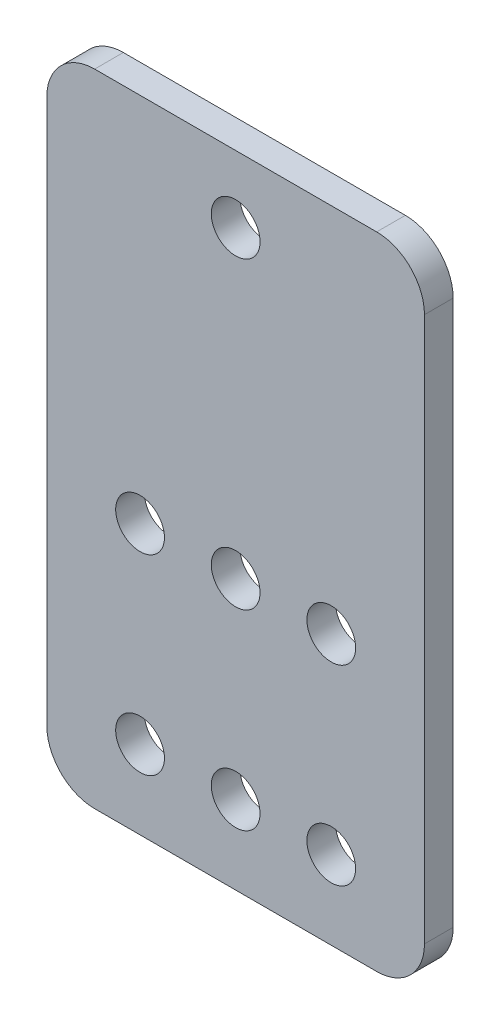
ISO-10303-21;
HEADER;
FILE_DESCRIPTION(('STEP AP214'),'2;1');
FILE_NAME('part.step','',(''),(''),'','','');
FILE_SCHEMA(('AUTOMOTIVE_DESIGN { 1 0 10303 214 1 1 1 1 }'));
ENDSEC;
DATA;
#1=APPLICATION_CONTEXT('core data for automotive mechanical design processes');
#2=APPLICATION_PROTOCOL_DEFINITION('international standard','automotive_design',2000,#1);
#3=PRODUCT_CONTEXT('',#1,'mechanical');
#4=PRODUCT('Part','Part','',(#3));
#5=PRODUCT_RELATED_PRODUCT_CATEGORY('part','',(#4));
#6=PRODUCT_DEFINITION_FORMATION('','',#4);
#7=PRODUCT_DEFINITION_CONTEXT('part definition',#1,'design');
#8=PRODUCT_DEFINITION('design','',#6,#7);
#9=PRODUCT_DEFINITION_SHAPE('','',#8);
#10=(LENGTH_UNIT() NAMED_UNIT(*) SI_UNIT(.MILLI.,.METRE.));
#11=(NAMED_UNIT(*) PLANE_ANGLE_UNIT() SI_UNIT($,.RADIAN.));
#12=(NAMED_UNIT(*) SI_UNIT($,.STERADIAN.) SOLID_ANGLE_UNIT());
#13=UNCERTAINTY_MEASURE_WITH_UNIT(LENGTH_MEASURE(1.E-05),#10,'distance_accuracy_value','');
#14=(GEOMETRIC_REPRESENTATION_CONTEXT(3) GLOBAL_UNCERTAINTY_ASSIGNED_CONTEXT((#13)) GLOBAL_UNIT_ASSIGNED_CONTEXT((#10,
#11,#12)) REPRESENTATION_CONTEXT('',''));
#15=CARTESIAN_POINT('',(0.,0.,0.));
#16=DIRECTION('',(0.,0.,1.));
#17=DIRECTION('',(1.,0.,0.));
#18=AXIS2_PLACEMENT_3D('',#15,#16,#17);
#19=CARTESIAN_POINT('',(14.75,28.5,3.));
#20=DIRECTION('',(0.,0.,-1.));
#21=DIRECTION('',(-1.,0.,0.));
#22=AXIS2_PLACEMENT_3D('',#19,#20,#21);
#23=PLANE('',#22);
#24=CARTESIAN_POINT('',(14.75,28.5,3.));
#25=DIRECTION('',(0.,0.,1.));
#26=DIRECTION('',(-1.,0.,0.));
#27=AXIS2_PLACEMENT_3D('',#24,#25,#26);
#28=CIRCLE('',#27,5.);
#29=CARTESIAN_POINT('',(19.75,28.5,3.));
#30=VERTEX_POINT('',#29);
#31=CARTESIAN_POINT('',(14.75,33.5,3.));
#32=VERTEX_POINT('',#31);
#33=EDGE_CURVE('E151',#30,#32,#28,.T.);
#34=ORIENTED_EDGE('',*,*,#33,.T.);
#35=DIRECTION('',(-1.,0.,0.));
#36=VECTOR('',#35,1.);
#37=CARTESIAN_POINT('',(-14.75,33.5,3.));
#38=LINE('',#37,#36);
#39=CARTESIAN_POINT('',(-14.75,33.5,3.));
#40=VERTEX_POINT('',#39);
#41=EDGE_CURVE('E99',#32,#40,#38,.T.);
#42=ORIENTED_EDGE('',*,*,#41,.T.);
#43=CARTESIAN_POINT('',(-14.75,28.5,3.));
#44=DIRECTION('',(0.,0.,1.));
#45=DIRECTION('',(-1.,0.,0.));
#46=AXIS2_PLACEMENT_3D('',#43,#44,#45);
#47=CIRCLE('',#46,5.);
#48=CARTESIAN_POINT('',(-19.75,28.5,3.));
#49=VERTEX_POINT('',#48);
#50=EDGE_CURVE('E166',#40,#49,#47,.T.);
#51=ORIENTED_EDGE('',*,*,#50,.T.);
#52=DIRECTION('',(0.,-1.,0.));
#53=VECTOR('',#52,1.);
#54=CARTESIAN_POINT('',(-19.75,-28.5,3.));
#55=LINE('',#54,#53);
#56=CARTESIAN_POINT('',(-19.75,-28.5,3.));
#57=VERTEX_POINT('',#56);
#58=EDGE_CURVE('E179',#49,#57,#55,.T.);
#59=ORIENTED_EDGE('',*,*,#58,.T.);
#60=CARTESIAN_POINT('',(-14.75,-28.5,3.));
#61=DIRECTION('',(0.,0.,1.));
#62=DIRECTION('',(-1.,0.,0.));
#63=AXIS2_PLACEMENT_3D('',#60,#61,#62);
#64=CIRCLE('',#63,5.);
#65=CARTESIAN_POINT('',(-14.75,-33.5,3.));
#66=VERTEX_POINT('',#65);
#67=EDGE_CURVE('E118',#57,#66,#64,.T.);
#68=ORIENTED_EDGE('',*,*,#67,.T.);
#69=DIRECTION('',(1.,0.,0.));
#70=VECTOR('',#69,1.);
#71=CARTESIAN_POINT('',(-14.75,-33.5,3.));
#72=LINE('',#71,#70);
#73=CARTESIAN_POINT('',(14.75,-33.5,3.));
#74=VERTEX_POINT('',#73);
#75=EDGE_CURVE('E112',#66,#74,#72,.T.);
#76=ORIENTED_EDGE('',*,*,#75,.T.);
#77=CARTESIAN_POINT('',(14.75,-28.5,3.));
#78=DIRECTION('',(0.,0.,1.));
#79=DIRECTION('',(1.,0.,0.));
#80=AXIS2_PLACEMENT_3D('',#77,#78,#79);
#81=CIRCLE('',#80,5.);
#82=CARTESIAN_POINT('',(19.75,-28.5,3.));
#83=VERTEX_POINT('',#82);
#84=EDGE_CURVE('E116',#74,#83,#81,.T.);
#85=ORIENTED_EDGE('',*,*,#84,.T.);
#86=DIRECTION('',(0.,1.,0.));
#87=VECTOR('',#86,1.);
#88=CARTESIAN_POINT('',(19.75,-28.5,3.));
#89=LINE('',#88,#87);
#90=EDGE_CURVE('E56',#83,#30,#89,.T.);
#91=ORIENTED_EDGE('',*,*,#90,.T.);
#92=EDGE_LOOP('',(#34,#42,#51,#59,#68,#76,#85,#91));
#93=FACE_BOUND('',#92,.T.);
#94=CARTESIAN_POINT('',(-9.99999999999999,-5.29,3.));
#95=DIRECTION('',(0.,0.,1.));
#96=DIRECTION('',(1.,0.,0.));
#97=AXIS2_PLACEMENT_3D('',#94,#95,#96);
#98=CIRCLE('',#97,2.55);
#99=CARTESIAN_POINT('',(-7.44999999999999,-5.29,3.));
#100=VERTEX_POINT('',#99);
#101=EDGE_CURVE('E140',#100,#100,#98,.T.);
#102=ORIENTED_EDGE('',*,*,#101,.F.);
#103=EDGE_LOOP('',(#102));
#104=FACE_BOUND('',#103,.T.);
#105=CARTESIAN_POINT('',(0.,-5.29,3.));
#106=DIRECTION('',(0.,0.,1.));
#107=DIRECTION('',(1.,0.,0.));
#108=AXIS2_PLACEMENT_3D('',#105,#106,#107);
#109=CIRCLE('',#108,2.55);
#110=CARTESIAN_POINT('',(2.55000000000001,-5.29,3.));
#111=VERTEX_POINT('',#110);
#112=EDGE_CURVE('E188',#111,#111,#109,.T.);
#113=ORIENTED_EDGE('',*,*,#112,.F.);
#114=EDGE_LOOP('',(#113));
#115=FACE_BOUND('',#114,.T.);
#116=CARTESIAN_POINT('',(10.,-5.29,3.));
#117=DIRECTION('',(0.,0.,1.));
#118=DIRECTION('',(1.,0.,0.));
#119=AXIS2_PLACEMENT_3D('',#116,#117,#118);
#120=CIRCLE('',#119,2.55);
#121=CARTESIAN_POINT('',(12.55,-5.29,3.));
#122=VERTEX_POINT('',#121);
#123=EDGE_CURVE('E194',#122,#122,#120,.T.);
#124=ORIENTED_EDGE('',*,*,#123,.F.);
#125=EDGE_LOOP('',(#124));
#126=FACE_BOUND('',#125,.T.);
#127=CARTESIAN_POINT('',(-9.99999999999999,-25.29,3.));
#128=DIRECTION('',(0.,0.,1.));
#129=DIRECTION('',(1.,0.,0.));
#130=AXIS2_PLACEMENT_3D('',#127,#128,#129);
#131=CIRCLE('',#130,2.55);
#132=CARTESIAN_POINT('',(-7.44999999999999,-25.29,3.));
#133=VERTEX_POINT('',#132);
#134=EDGE_CURVE('E200',#133,#133,#131,.T.);
#135=ORIENTED_EDGE('',*,*,#134,.F.);
#136=EDGE_LOOP('',(#135));
#137=FACE_BOUND('',#136,.T.);
#138=CARTESIAN_POINT('',(0.,-25.29,3.));
#139=DIRECTION('',(0.,0.,1.));
#140=DIRECTION('',(1.,0.,0.));
#141=AXIS2_PLACEMENT_3D('',#138,#139,#140);
#142=CIRCLE('',#141,2.55);
#143=CARTESIAN_POINT('',(2.55000000000001,-25.29,3.));
#144=VERTEX_POINT('',#143);
#145=EDGE_CURVE('E206',#144,#144,#142,.T.);
#146=ORIENTED_EDGE('',*,*,#145,.F.);
#147=EDGE_LOOP('',(#146));
#148=FACE_BOUND('',#147,.T.);
#149=CARTESIAN_POINT('',(0.,26.5,3.));
#150=DIRECTION('',(0.,0.,1.));
#151=DIRECTION('',(1.,0.,0.));
#152=AXIS2_PLACEMENT_3D('',#149,#150,#151);
#153=CIRCLE('',#152,2.55);
#154=CARTESIAN_POINT('',(2.55,26.5,3.));
#155=VERTEX_POINT('',#154);
#156=EDGE_CURVE('E212',#155,#155,#153,.T.);
#157=ORIENTED_EDGE('',*,*,#156,.F.);
#158=EDGE_LOOP('',(#157));
#159=FACE_BOUND('',#158,.T.);
#160=CARTESIAN_POINT('',(10.,-25.29,3.));
#161=DIRECTION('',(0.,0.,1.));
#162=DIRECTION('',(1.,0.,0.));
#163=AXIS2_PLACEMENT_3D('',#160,#161,#162);
#164=CIRCLE('',#163,2.55);
#165=CARTESIAN_POINT('',(12.55,-25.29,3.));
#166=VERTEX_POINT('',#165);
#167=EDGE_CURVE('E218',#166,#166,#164,.T.);
#168=ORIENTED_EDGE('',*,*,#167,.F.);
#169=EDGE_LOOP('',(#168));
#170=FACE_BOUND('',#169,.T.);
#171=ADVANCED_FACE('F39',(#93,#104,#115,#126,#137,#148,#159,#170),#23,.F.);
#172=CARTESIAN_POINT('',(14.75,28.5,0.));
#173=DIRECTION('',(0.,0.,-1.));
#174=DIRECTION('',(-1.,0.,0.));
#175=AXIS2_PLACEMENT_3D('',#172,#173,#174);
#176=PLANE('',#175);
#177=CARTESIAN_POINT('',(0.,26.5,0.));
#178=DIRECTION('',(0.,0.,1.));
#179=DIRECTION('',(1.,0.,0.));
#180=AXIS2_PLACEMENT_3D('',#177,#178,#179);
#181=CIRCLE('',#180,2.55);
#182=CARTESIAN_POINT('',(2.55,26.5,0.));
#183=VERTEX_POINT('',#182);
#184=EDGE_CURVE('E215',#183,#183,#181,.T.);
#185=ORIENTED_EDGE('',*,*,#184,.T.);
#186=EDGE_LOOP('',(#185));
#187=FACE_BOUND('',#186,.T.);
#188=CARTESIAN_POINT('',(-9.99999999999999,-25.29,0.));
#189=DIRECTION('',(0.,0.,1.));
#190=DIRECTION('',(1.,0.,0.));
#191=AXIS2_PLACEMENT_3D('',#188,#189,#190);
#192=CIRCLE('',#191,2.55);
#193=CARTESIAN_POINT('',(-7.44999999999999,-25.29,0.));
#194=VERTEX_POINT('',#193);
#195=EDGE_CURVE('E203',#194,#194,#192,.T.);
#196=ORIENTED_EDGE('',*,*,#195,.T.);
#197=EDGE_LOOP('',(#196));
#198=FACE_BOUND('',#197,.T.);
#199=CARTESIAN_POINT('',(0.,-5.29,0.));
#200=DIRECTION('',(0.,0.,1.));
#201=DIRECTION('',(1.,0.,0.));
#202=AXIS2_PLACEMENT_3D('',#199,#200,#201);
#203=CIRCLE('',#202,2.55);
#204=CARTESIAN_POINT('',(2.55000000000001,-5.29,0.));
#205=VERTEX_POINT('',#204);
#206=EDGE_CURVE('E191',#205,#205,#203,.T.);
#207=ORIENTED_EDGE('',*,*,#206,.T.);
#208=EDGE_LOOP('',(#207));
#209=FACE_BOUND('',#208,.T.);
#210=CARTESIAN_POINT('',(14.75,28.5,0.));
#211=DIRECTION('',(0.,0.,1.));
#212=DIRECTION('',(-1.,0.,0.));
#213=AXIS2_PLACEMENT_3D('',#210,#211,#212);
#214=CIRCLE('',#213,5.);
#215=CARTESIAN_POINT('',(19.75,28.5,0.));
#216=VERTEX_POINT('',#215);
#217=CARTESIAN_POINT('',(14.75,33.5,0.));
#218=VERTEX_POINT('',#217);
#219=EDGE_CURVE('E136',#216,#218,#214,.T.);
#220=ORIENTED_EDGE('',*,*,#219,.F.);
#221=DIRECTION('',(0.,1.,0.));
#222=VECTOR('',#221,1.);
#223=CARTESIAN_POINT('',(19.75,-28.5,0.));
#224=LINE('',#223,#222);
#225=CARTESIAN_POINT('',(19.75,-28.5,0.));
#226=VERTEX_POINT('',#225);
#227=EDGE_CURVE('E91',#226,#216,#224,.T.);
#228=ORIENTED_EDGE('',*,*,#227,.F.);
#229=CARTESIAN_POINT('',(14.75,-28.5,0.));
#230=DIRECTION('',(0.,0.,1.));
#231=DIRECTION('',(1.,0.,0.));
#232=AXIS2_PLACEMENT_3D('',#229,#230,#231);
#233=CIRCLE('',#232,5.);
#234=CARTESIAN_POINT('',(14.75,-33.5,0.));
#235=VERTEX_POINT('',#234);
#236=EDGE_CURVE('E85',#235,#226,#233,.T.);
#237=ORIENTED_EDGE('',*,*,#236,.F.);
#238=DIRECTION('',(1.,0.,0.));
#239=VECTOR('',#238,1.);
#240=CARTESIAN_POINT('',(-14.75,-33.5,0.));
#241=LINE('',#240,#239);
#242=CARTESIAN_POINT('',(-14.75,-33.5,0.));
#243=VERTEX_POINT('',#242);
#244=EDGE_CURVE('E126',#243,#235,#241,.T.);
#245=ORIENTED_EDGE('',*,*,#244,.F.);
#246=CARTESIAN_POINT('',(-14.75,-28.5,0.));
#247=DIRECTION('',(0.,0.,1.));
#248=DIRECTION('',(-1.,0.,0.));
#249=AXIS2_PLACEMENT_3D('',#246,#247,#248);
#250=CIRCLE('',#249,5.);
#251=CARTESIAN_POINT('',(-19.75,-28.5,0.));
#252=VERTEX_POINT('',#251);
#253=EDGE_CURVE('E146',#252,#243,#250,.T.);
#254=ORIENTED_EDGE('',*,*,#253,.F.);
#255=DIRECTION('',(0.,-1.,0.));
#256=VECTOR('',#255,1.);
#257=CARTESIAN_POINT('',(-19.75,-28.5,0.));
#258=LINE('',#257,#256);
#259=CARTESIAN_POINT('',(-19.75,28.5,0.));
#260=VERTEX_POINT('',#259);
#261=EDGE_CURVE('E144',#260,#252,#258,.T.);
#262=ORIENTED_EDGE('',*,*,#261,.F.);
#263=CARTESIAN_POINT('',(-14.75,28.5,0.));
#264=DIRECTION('',(0.,0.,1.));
#265=DIRECTION('',(-1.,0.,0.));
#266=AXIS2_PLACEMENT_3D('',#263,#264,#265);
#267=CIRCLE('',#266,5.);
#268=CARTESIAN_POINT('',(-14.75,33.5,0.));
#269=VERTEX_POINT('',#268);
#270=EDGE_CURVE('E142',#269,#260,#267,.T.);
#271=ORIENTED_EDGE('',*,*,#270,.F.);
#272=DIRECTION('',(-1.,0.,0.));
#273=VECTOR('',#272,1.);
#274=CARTESIAN_POINT('',(-14.75,33.5,0.));
#275=LINE('',#274,#273);
#276=EDGE_CURVE('E139',#218,#269,#275,.T.);
#277=ORIENTED_EDGE('',*,*,#276,.F.);
#278=EDGE_LOOP('',(#220,#228,#237,#245,#254,#262,#271,#277));
#279=FACE_BOUND('',#278,.T.);
#280=CARTESIAN_POINT('',(-9.99999999999999,-5.29,0.));
#281=DIRECTION('',(0.,0.,1.));
#282=DIRECTION('',(1.,0.,0.));
#283=AXIS2_PLACEMENT_3D('',#280,#281,#282);
#284=CIRCLE('',#283,2.55);
#285=CARTESIAN_POINT('',(-7.44999999999999,-5.29,0.));
#286=VERTEX_POINT('',#285);
#287=EDGE_CURVE('E185',#286,#286,#284,.T.);
#288=ORIENTED_EDGE('',*,*,#287,.T.);
#289=EDGE_LOOP('',(#288));
#290=FACE_BOUND('',#289,.T.);
#291=CARTESIAN_POINT('',(10.,-5.29,0.));
#292=DIRECTION('',(0.,0.,1.));
#293=DIRECTION('',(1.,0.,0.));
#294=AXIS2_PLACEMENT_3D('',#291,#292,#293);
#295=CIRCLE('',#294,2.55);
#296=CARTESIAN_POINT('',(12.55,-5.29,0.));
#297=VERTEX_POINT('',#296);
#298=EDGE_CURVE('E197',#297,#297,#295,.T.);
#299=ORIENTED_EDGE('',*,*,#298,.T.);
#300=EDGE_LOOP('',(#299));
#301=FACE_BOUND('',#300,.T.);
#302=CARTESIAN_POINT('',(0.,-25.29,0.));
#303=DIRECTION('',(0.,0.,1.));
#304=DIRECTION('',(1.,0.,0.));
#305=AXIS2_PLACEMENT_3D('',#302,#303,#304);
#306=CIRCLE('',#305,2.55);
#307=CARTESIAN_POINT('',(2.55000000000001,-25.29,0.));
#308=VERTEX_POINT('',#307);
#309=EDGE_CURVE('E209',#308,#308,#306,.T.);
#310=ORIENTED_EDGE('',*,*,#309,.T.);
#311=EDGE_LOOP('',(#310));
#312=FACE_BOUND('',#311,.T.);
#313=CARTESIAN_POINT('',(10.,-25.29,0.));
#314=DIRECTION('',(0.,0.,1.));
#315=DIRECTION('',(1.,0.,0.));
#316=AXIS2_PLACEMENT_3D('',#313,#314,#315);
#317=CIRCLE('',#316,2.55);
#318=CARTESIAN_POINT('',(12.55,-25.29,0.));
#319=VERTEX_POINT('',#318);
#320=EDGE_CURVE('E221',#319,#319,#317,.T.);
#321=ORIENTED_EDGE('',*,*,#320,.T.);
#322=EDGE_LOOP('',(#321));
#323=FACE_BOUND('',#322,.T.);
#324=ADVANCED_FACE('F170',(#187,#198,#209,#279,#290,#301,#312,#323),#176,.T.);
#325=CARTESIAN_POINT('',(14.75,28.5,3.));
#326=DIRECTION('',(0.,0.,-1.));
#327=DIRECTION('',(-1.,0.,0.));
#328=AXIS2_PLACEMENT_3D('',#325,#326,#327);
#329=CYLINDRICAL_SURFACE('',#328,5.);
#330=ORIENTED_EDGE('',*,*,#219,.T.);
#331=DIRECTION('',(0.,0.,-1.));
#332=VECTOR('',#331,1.);
#333=CARTESIAN_POINT('',(14.75,33.5,3.));
#334=LINE('',#333,#332);
#335=EDGE_CURVE('E11',#32,#218,#334,.T.);
#336=ORIENTED_EDGE('',*,*,#335,.F.);
#337=ORIENTED_EDGE('',*,*,#33,.F.);
#338=DIRECTION('',(0.,0.,-1.));
#339=VECTOR('',#338,1.);
#340=CARTESIAN_POINT('',(19.75,28.5,3.));
#341=LINE('',#340,#339);
#342=EDGE_CURVE('E132',#30,#216,#341,.T.);
#343=ORIENTED_EDGE('',*,*,#342,.T.);
#344=EDGE_LOOP('',(#330,#336,#337,#343));
#345=FACE_BOUND('',#344,.T.);
#346=ADVANCED_FACE('F41',(#345),#329,.T.);
#347=CARTESIAN_POINT('',(-14.75,33.5,3.));
#348=DIRECTION('',(0.,-1.,0.));
#349=DIRECTION('',(0.,0.,-1.));
#350=AXIS2_PLACEMENT_3D('',#347,#348,#349);
#351=PLANE('',#350);
#352=ORIENTED_EDGE('',*,*,#276,.T.);
#353=DIRECTION('',(0.,0.,-1.));
#354=VECTOR('',#353,1.);
#355=CARTESIAN_POINT('',(-14.75,33.5,3.));
#356=LINE('',#355,#354);
#357=EDGE_CURVE('E48',#40,#269,#356,.T.);
#358=ORIENTED_EDGE('',*,*,#357,.F.);
#359=ORIENTED_EDGE('',*,*,#41,.F.);
#360=ORIENTED_EDGE('',*,*,#335,.T.);
#361=EDGE_LOOP('',(#352,#358,#359,#360));
#362=FACE_BOUND('',#361,.T.);
#363=ADVANCED_FACE('F253',(#362),#351,.F.);
#364=CARTESIAN_POINT('',(-14.75,28.5,3.));
#365=DIRECTION('',(0.,0.,-1.));
#366=DIRECTION('',(-1.,0.,0.));
#367=AXIS2_PLACEMENT_3D('',#364,#365,#366);
#368=CYLINDRICAL_SURFACE('',#367,5.);
#369=ORIENTED_EDGE('',*,*,#270,.T.);
#370=DIRECTION('',(0.,0.,-1.));
#371=VECTOR('',#370,1.);
#372=CARTESIAN_POINT('',(-19.75,28.5,3.));
#373=LINE('',#372,#371);
#374=EDGE_CURVE('E158',#49,#260,#373,.T.);
#375=ORIENTED_EDGE('',*,*,#374,.F.);
#376=ORIENTED_EDGE('',*,*,#50,.F.);
#377=ORIENTED_EDGE('',*,*,#357,.T.);
#378=EDGE_LOOP('',(#369,#375,#376,#377));
#379=FACE_BOUND('',#378,.T.);
#380=ADVANCED_FACE('F164',(#379),#368,.T.);
#381=CARTESIAN_POINT('',(-19.75,-28.5,3.));
#382=DIRECTION('',(1.,0.,0.));
#383=DIRECTION('',(0.,0.,-1.));
#384=AXIS2_PLACEMENT_3D('',#381,#382,#383);
#385=PLANE('',#384);
#386=ORIENTED_EDGE('',*,*,#261,.T.);
#387=DIRECTION('',(0.,0.,-1.));
#388=VECTOR('',#387,1.);
#389=CARTESIAN_POINT('',(-19.75,-28.5,3.));
#390=LINE('',#389,#388);
#391=EDGE_CURVE('E155',#57,#252,#390,.T.);
#392=ORIENTED_EDGE('',*,*,#391,.F.);
#393=ORIENTED_EDGE('',*,*,#58,.F.);
#394=ORIENTED_EDGE('',*,*,#374,.T.);
#395=EDGE_LOOP('',(#386,#392,#393,#394));
#396=FACE_BOUND('',#395,.T.);
#397=ADVANCED_FACE('F175',(#396),#385,.F.);
#398=CARTESIAN_POINT('',(-14.75,-28.5,3.));
#399=DIRECTION('',(0.,0.,-1.));
#400=DIRECTION('',(-1.,0.,0.));
#401=AXIS2_PLACEMENT_3D('',#398,#399,#400);
#402=CYLINDRICAL_SURFACE('',#401,5.);
#403=ORIENTED_EDGE('',*,*,#253,.T.);
#404=DIRECTION('',(0.,0.,-1.));
#405=VECTOR('',#404,1.);
#406=CARTESIAN_POINT('',(-14.75,-33.5,3.));
#407=LINE('',#406,#405);
#408=EDGE_CURVE('E127',#66,#243,#407,.T.);
#409=ORIENTED_EDGE('',*,*,#408,.F.);
#410=ORIENTED_EDGE('',*,*,#67,.F.);
#411=ORIENTED_EDGE('',*,*,#391,.T.);
#412=EDGE_LOOP('',(#403,#409,#410,#411));
#413=FACE_BOUND('',#412,.T.);
#414=ADVANCED_FACE('F178',(#413),#402,.T.);
#415=CARTESIAN_POINT('',(-14.75,-33.5,3.));
#416=DIRECTION('',(0.,1.,0.));
#417=DIRECTION('',(0.,0.,1.));
#418=AXIS2_PLACEMENT_3D('',#415,#416,#417);
#419=PLANE('',#418);
#420=ORIENTED_EDGE('',*,*,#244,.T.);
#421=DIRECTION('',(0.,0.,-1.));
#422=VECTOR('',#421,1.);
#423=CARTESIAN_POINT('',(14.75,-33.5,3.));
#424=LINE('',#423,#422);
#425=EDGE_CURVE('E123',#74,#235,#424,.T.);
#426=ORIENTED_EDGE('',*,*,#425,.F.);
#427=ORIENTED_EDGE('',*,*,#75,.F.);
#428=ORIENTED_EDGE('',*,*,#408,.T.);
#429=EDGE_LOOP('',(#420,#426,#427,#428));
#430=FACE_BOUND('',#429,.T.);
#431=ADVANCED_FACE('F124',(#430),#419,.F.);
#432=CARTESIAN_POINT('',(14.75,-28.5,3.));
#433=DIRECTION('',(0.,0.,-1.));
#434=DIRECTION('',(-1.,0.,0.));
#435=AXIS2_PLACEMENT_3D('',#432,#433,#434);
#436=CYLINDRICAL_SURFACE('',#435,5.);
#437=ORIENTED_EDGE('',*,*,#236,.T.);
#438=DIRECTION('',(0.,0.,-1.));
#439=VECTOR('',#438,1.);
#440=CARTESIAN_POINT('',(19.75,-28.5,3.));
#441=LINE('',#440,#439);
#442=EDGE_CURVE('E128',#83,#226,#441,.T.);
#443=ORIENTED_EDGE('',*,*,#442,.F.);
#444=ORIENTED_EDGE('',*,*,#84,.F.);
#445=ORIENTED_EDGE('',*,*,#425,.T.);
#446=EDGE_LOOP('',(#437,#443,#444,#445));
#447=FACE_BOUND('',#446,.T.);
#448=ADVANCED_FACE('F130',(#447),#436,.T.);
#449=CARTESIAN_POINT('',(19.75,-28.5,3.));
#450=DIRECTION('',(-1.,0.,0.));
#451=DIRECTION('',(0.,0.,1.));
#452=AXIS2_PLACEMENT_3D('',#449,#450,#451);
#453=PLANE('',#452);
#454=ORIENTED_EDGE('',*,*,#227,.T.);
#455=ORIENTED_EDGE('',*,*,#342,.F.);
#456=ORIENTED_EDGE('',*,*,#90,.F.);
#457=ORIENTED_EDGE('',*,*,#442,.T.);
#458=EDGE_LOOP('',(#454,#455,#456,#457));
#459=FACE_BOUND('',#458,.T.);
#460=ADVANCED_FACE('F241',(#459),#453,.F.);
#461=CARTESIAN_POINT('',(-9.99999999999999,-5.29,3.));
#462=DIRECTION('',(0.,0.,-1.));
#463=DIRECTION('',(-1.,0.,0.));
#464=AXIS2_PLACEMENT_3D('',#461,#462,#463);
#465=CYLINDRICAL_SURFACE('',#464,2.55);
#466=ORIENTED_EDGE('',*,*,#101,.T.);
#467=EDGE_LOOP('',(#466));
#468=FACE_BOUND('',#467,.T.);
#469=ORIENTED_EDGE('',*,*,#287,.F.);
#470=EDGE_LOOP('',(#469));
#471=FACE_BOUND('',#470,.T.);
#472=ADVANCED_FACE('F238',(#468,#471),#465,.F.);
#473=CARTESIAN_POINT('',(0.,-5.29,3.));
#474=DIRECTION('',(0.,0.,-1.));
#475=DIRECTION('',(-1.,0.,0.));
#476=AXIS2_PLACEMENT_3D('',#473,#474,#475);
#477=CYLINDRICAL_SURFACE('',#476,2.55);
#478=ORIENTED_EDGE('',*,*,#112,.T.);
#479=EDGE_LOOP('',(#478));
#480=FACE_BOUND('',#479,.T.);
#481=ORIENTED_EDGE('',*,*,#206,.F.);
#482=EDGE_LOOP('',(#481));
#483=FACE_BOUND('',#482,.T.);
#484=ADVANCED_FACE('F329',(#480,#483),#477,.F.);
#485=CARTESIAN_POINT('',(10.,-5.29,3.));
#486=DIRECTION('',(0.,0.,-1.));
#487=DIRECTION('',(-1.,0.,0.));
#488=AXIS2_PLACEMENT_3D('',#485,#486,#487);
#489=CYLINDRICAL_SURFACE('',#488,2.55);
#490=ORIENTED_EDGE('',*,*,#123,.T.);
#491=EDGE_LOOP('',(#490));
#492=FACE_BOUND('',#491,.T.);
#493=ORIENTED_EDGE('',*,*,#298,.F.);
#494=EDGE_LOOP('',(#493));
#495=FACE_BOUND('',#494,.T.);
#496=ADVANCED_FACE('F338',(#492,#495),#489,.F.);
#497=CARTESIAN_POINT('',(-9.99999999999999,-25.29,3.));
#498=DIRECTION('',(0.,0.,-1.));
#499=DIRECTION('',(-1.,0.,0.));
#500=AXIS2_PLACEMENT_3D('',#497,#498,#499);
#501=CYLINDRICAL_SURFACE('',#500,2.55);
#502=ORIENTED_EDGE('',*,*,#134,.T.);
#503=EDGE_LOOP('',(#502));
#504=FACE_BOUND('',#503,.T.);
#505=ORIENTED_EDGE('',*,*,#195,.F.);
#506=EDGE_LOOP('',(#505));
#507=FACE_BOUND('',#506,.T.);
#508=ADVANCED_FACE('F347',(#504,#507),#501,.F.);
#509=CARTESIAN_POINT('',(0.,-25.29,3.));
#510=DIRECTION('',(0.,0.,-1.));
#511=DIRECTION('',(-1.,0.,0.));
#512=AXIS2_PLACEMENT_3D('',#509,#510,#511);
#513=CYLINDRICAL_SURFACE('',#512,2.55);
#514=ORIENTED_EDGE('',*,*,#145,.T.);
#515=EDGE_LOOP('',(#514));
#516=FACE_BOUND('',#515,.T.);
#517=ORIENTED_EDGE('',*,*,#309,.F.);
#518=EDGE_LOOP('',(#517));
#519=FACE_BOUND('',#518,.T.);
#520=ADVANCED_FACE('F357',(#516,#519),#513,.F.);
#521=CARTESIAN_POINT('',(0.,26.5,3.));
#522=DIRECTION('',(0.,0.,-1.));
#523=DIRECTION('',(-1.,0.,0.));
#524=AXIS2_PLACEMENT_3D('',#521,#522,#523);
#525=CYLINDRICAL_SURFACE('',#524,2.55);
#526=ORIENTED_EDGE('',*,*,#156,.T.);
#527=EDGE_LOOP('',(#526));
#528=FACE_BOUND('',#527,.T.);
#529=ORIENTED_EDGE('',*,*,#184,.F.);
#530=EDGE_LOOP('',(#529));
#531=FACE_BOUND('',#530,.T.);
#532=ADVANCED_FACE('F367',(#528,#531),#525,.F.);
#533=CARTESIAN_POINT('',(10.,-25.29,3.));
#534=DIRECTION('',(0.,0.,-1.));
#535=DIRECTION('',(-1.,0.,0.));
#536=AXIS2_PLACEMENT_3D('',#533,#534,#535);
#537=CYLINDRICAL_SURFACE('',#536,2.55);
#538=ORIENTED_EDGE('',*,*,#167,.T.);
#539=EDGE_LOOP('',(#538));
#540=FACE_BOUND('',#539,.T.);
#541=ORIENTED_EDGE('',*,*,#320,.F.);
#542=EDGE_LOOP('',(#541));
#543=FACE_BOUND('',#542,.T.);
#544=ADVANCED_FACE('F227',(#540,#543),#537,.F.);
#545=CLOSED_SHELL('',(#171,#324,#346,#363,#380,#397,#414,#431,#448,#460,#472,#484,#496,#508,
#520,#532,#544));
#546=MANIFOLD_SOLID_BREP('B2',#545);
#547=ADVANCED_BREP_SHAPE_REPRESENTATION('',(#18,#546),#14);
#548=SHAPE_DEFINITION_REPRESENTATION(#9,#547);
ENDSEC;
END-ISO-10303-21;
